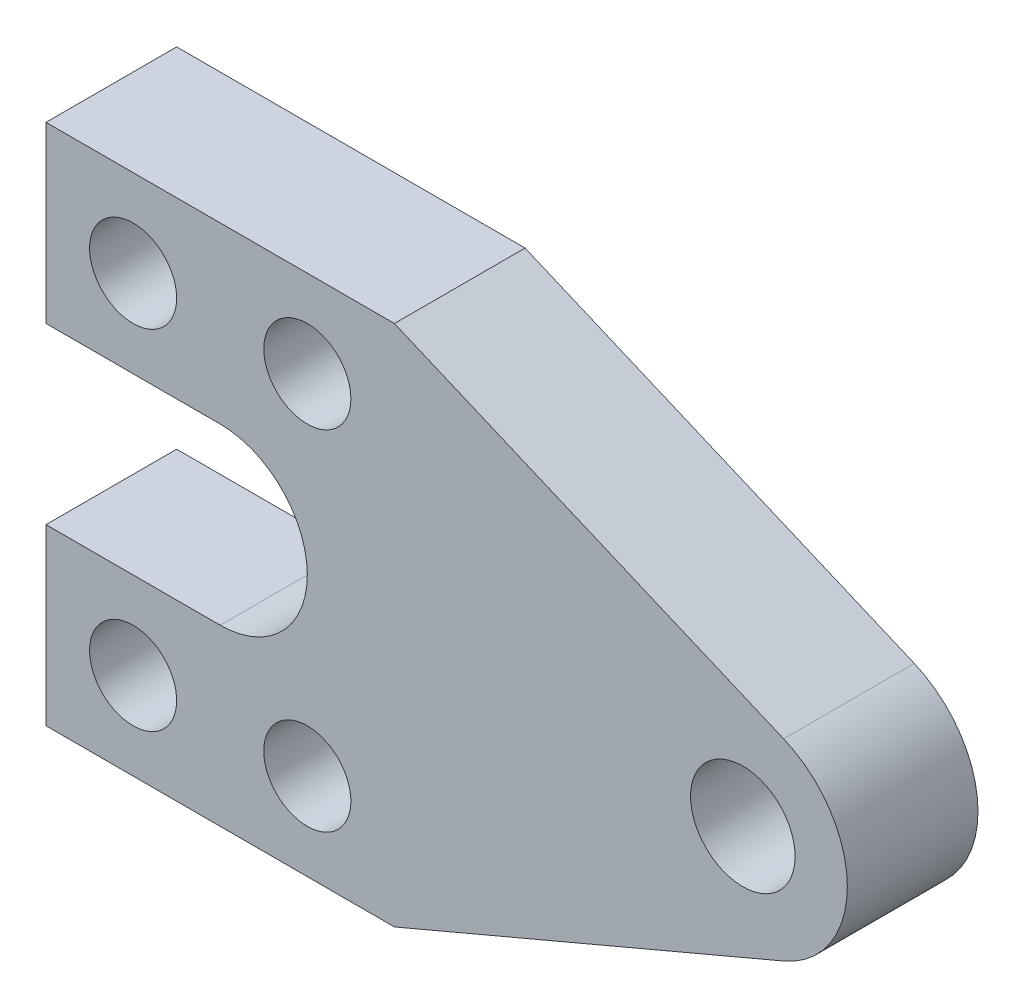
ISO-10303-21;
HEADER;
FILE_DESCRIPTION(('STEP AP214'),'2;1');
FILE_NAME('part.step','',(''),(''),'','','');
FILE_SCHEMA(('AUTOMOTIVE_DESIGN { 1 0 10303 214 1 1 1 1 }'));
ENDSEC;
DATA;
#1=APPLICATION_CONTEXT('core data for automotive mechanical design processes');
#2=APPLICATION_PROTOCOL_DEFINITION('international standard','automotive_design',2000,#1);
#3=PRODUCT_CONTEXT('',#1,'mechanical');
#4=PRODUCT('Part','Part','',(#3));
#5=PRODUCT_RELATED_PRODUCT_CATEGORY('part','',(#4));
#6=PRODUCT_DEFINITION_FORMATION('','',#4);
#7=PRODUCT_DEFINITION_CONTEXT('part definition',#1,'design');
#8=PRODUCT_DEFINITION('design','',#6,#7);
#9=PRODUCT_DEFINITION_SHAPE('','',#8);
#10=(LENGTH_UNIT() NAMED_UNIT(*) SI_UNIT(.MILLI.,.METRE.));
#11=(NAMED_UNIT(*) PLANE_ANGLE_UNIT() SI_UNIT($,.RADIAN.));
#12=(NAMED_UNIT(*) SI_UNIT($,.STERADIAN.) SOLID_ANGLE_UNIT());
#13=UNCERTAINTY_MEASURE_WITH_UNIT(LENGTH_MEASURE(1.E-05),#10,'distance_accuracy_value','');
#14=(GEOMETRIC_REPRESENTATION_CONTEXT(3) GLOBAL_UNCERTAINTY_ASSIGNED_CONTEXT((#13)) GLOBAL_UNIT_ASSIGNED_CONTEXT((#10,
#11,#12)) REPRESENTATION_CONTEXT('',''));
#15=CARTESIAN_POINT('',(0.,0.,0.));
#16=DIRECTION('',(0.,0.,1.));
#17=DIRECTION('',(1.,0.,0.));
#18=AXIS2_PLACEMENT_3D('',#15,#16,#17);
#19=CARTESIAN_POINT('',(-60.,0.,15.));
#20=DIRECTION('',(0.,0.,-1.));
#21=DIRECTION('',(-1.,0.,0.));
#22=AXIS2_PLACEMENT_3D('',#19,#20,#21);
#23=PLANE('',#22);
#24=DIRECTION('',(0.,-1.,0.));
#25=VECTOR('',#24,1.);
#26=CARTESIAN_POINT('',(-80.,30.,15.));
#27=LINE('',#26,#25);
#28=CARTESIAN_POINT('',(-80.,30.,15.));
#29=VERTEX_POINT('',#28);
#30=CARTESIAN_POINT('',(-80.,9.99999999999999,15.));
#31=VERTEX_POINT('',#30);
#32=EDGE_CURVE('E169',#29,#31,#27,.T.);
#33=ORIENTED_EDGE('',*,*,#32,.T.);
#34=DIRECTION('',(1.,0.,0.));
#35=VECTOR('',#34,1.);
#36=CARTESIAN_POINT('',(-80.,9.99999999999999,15.));
#37=LINE('',#36,#35);
#38=CARTESIAN_POINT('',(-60.,9.99999999999999,15.));
#39=VERTEX_POINT('',#38);
#40=EDGE_CURVE('E107',#31,#39,#37,.T.);
#41=ORIENTED_EDGE('',*,*,#40,.T.);
#42=CARTESIAN_POINT('',(-60.,0.,15.));
#43=DIRECTION('',(0.,0.,-1.));
#44=DIRECTION('',(-1.,0.,0.));
#45=AXIS2_PLACEMENT_3D('',#42,#43,#44);
#46=CIRCLE('',#45,10.);
#47=CARTESIAN_POINT('',(-60.,-10.,15.));
#48=VERTEX_POINT('',#47);
#49=EDGE_CURVE('E190',#39,#48,#46,.T.);
#50=ORIENTED_EDGE('',*,*,#49,.T.);
#51=DIRECTION('',(-1.,0.,0.));
#52=VECTOR('',#51,1.);
#53=CARTESIAN_POINT('',(-60.,-10.,15.));
#54=LINE('',#53,#52);
#55=CARTESIAN_POINT('',(-80.,-10.,15.));
#56=VERTEX_POINT('',#55);
#57=EDGE_CURVE('E209',#48,#56,#54,.T.);
#58=ORIENTED_EDGE('',*,*,#57,.T.);
#59=DIRECTION('',(0.,-1.,0.));
#60=VECTOR('',#59,1.);
#61=CARTESIAN_POINT('',(-80.,-10.,15.));
#62=LINE('',#61,#60);
#63=CARTESIAN_POINT('',(-80.,-30.,15.));
#64=VERTEX_POINT('',#63);
#65=EDGE_CURVE('E206',#56,#64,#62,.T.);
#66=ORIENTED_EDGE('',*,*,#65,.T.);
#67=DIRECTION('',(1.,0.,0.));
#68=VECTOR('',#67,1.);
#69=CARTESIAN_POINT('',(-80.,-30.,15.));
#70=LINE('',#69,#68);
#71=CARTESIAN_POINT('',(-40.,-30.,15.));
#72=VERTEX_POINT('',#71);
#73=EDGE_CURVE('E208',#64,#72,#70,.T.);
#74=ORIENTED_EDGE('',*,*,#73,.T.);
#75=DIRECTION('',(0.920618310368742,0.390463732776557,0.));
#76=VECTOR('',#75,1.);
#77=CARTESIAN_POINT('',(-40.,-30.,15.));
#78=LINE('',#77,#76);
#79=CARTESIAN_POINT('',(4.68556479331867,-11.0474197244249,15.));
#80=VERTEX_POINT('',#79);
#81=EDGE_CURVE('E132',#72,#80,#78,.T.);
#82=ORIENTED_EDGE('',*,*,#81,.T.);
#83=CARTESIAN_POINT('',(0.,0.,15.));
#84=DIRECTION('',(0.,0.,1.));
#85=DIRECTION('',(1.,0.,0.));
#86=AXIS2_PLACEMENT_3D('',#83,#84,#85);
#87=CIRCLE('',#86,12.);
#88=CARTESIAN_POINT('',(4.68556479331867,11.0474197244249,15.));
#89=VERTEX_POINT('',#88);
#90=EDGE_CURVE('E126',#80,#89,#87,.T.);
#91=ORIENTED_EDGE('',*,*,#90,.T.);
#92=DIRECTION('',(-0.920618310368742,0.390463732776557,0.));
#93=VECTOR('',#92,1.);
#94=CARTESIAN_POINT('',(-40.,30.,15.));
#95=LINE('',#94,#93);
#96=CARTESIAN_POINT('',(-40.,30.,15.));
#97=VERTEX_POINT('',#96);
#98=EDGE_CURVE('E130',#89,#97,#95,.T.);
#99=ORIENTED_EDGE('',*,*,#98,.T.);
#100=DIRECTION('',(-1.,0.,0.));
#101=VECTOR('',#100,1.);
#102=CARTESIAN_POINT('',(-80.,30.,15.));
#103=LINE('',#102,#101);
#104=EDGE_CURVE('E58',#97,#29,#103,.T.);
#105=ORIENTED_EDGE('',*,*,#104,.T.);
#106=EDGE_LOOP('',(#33,#41,#50,#58,#66,#74,#82,#91,#99,#105));
#107=FACE_BOUND('',#106,.T.);
#108=CARTESIAN_POINT('',(0.,0.,15.));
#109=DIRECTION('',(0.,0.,1.));
#110=DIRECTION('',(1.,0.,0.));
#111=AXIS2_PLACEMENT_3D('',#108,#109,#110);
#112=CIRCLE('',#111,6.);
#113=CARTESIAN_POINT('',(6.,0.,15.));
#114=VERTEX_POINT('',#113);
#115=EDGE_CURVE('E154',#114,#114,#112,.T.);
#116=ORIENTED_EDGE('',*,*,#115,.F.);
#117=EDGE_LOOP('',(#116));
#118=FACE_BOUND('',#117,.T.);
#119=CARTESIAN_POINT('',(-70.,20.,15.));
#120=DIRECTION('',(0.,0.,1.));
#121=DIRECTION('',(1.,0.,0.));
#122=AXIS2_PLACEMENT_3D('',#119,#120,#121);
#123=CIRCLE('',#122,5.);
#124=CARTESIAN_POINT('',(-65.,20.,15.));
#125=VERTEX_POINT('',#124);
#126=EDGE_CURVE('E220',#125,#125,#123,.T.);
#127=ORIENTED_EDGE('',*,*,#126,.F.);
#128=EDGE_LOOP('',(#127));
#129=FACE_BOUND('',#128,.T.);
#130=CARTESIAN_POINT('',(-50.,20.,15.));
#131=DIRECTION('',(0.,0.,1.));
#132=DIRECTION('',(1.,0.,0.));
#133=AXIS2_PLACEMENT_3D('',#130,#131,#132);
#134=CIRCLE('',#133,5.);
#135=CARTESIAN_POINT('',(-45.,20.,15.));
#136=VERTEX_POINT('',#135);
#137=EDGE_CURVE('E226',#136,#136,#134,.T.);
#138=ORIENTED_EDGE('',*,*,#137,.F.);
#139=EDGE_LOOP('',(#138));
#140=FACE_BOUND('',#139,.T.);
#141=CARTESIAN_POINT('',(-70.,-20.,15.));
#142=DIRECTION('',(0.,0.,1.));
#143=DIRECTION('',(-1.,0.,0.));
#144=AXIS2_PLACEMENT_3D('',#141,#142,#143);
#145=CIRCLE('',#144,5.);
#146=CARTESIAN_POINT('',(-75.,-20.,15.));
#147=VERTEX_POINT('',#146);
#148=EDGE_CURVE('E232',#147,#147,#145,.T.);
#149=ORIENTED_EDGE('',*,*,#148,.F.);
#150=EDGE_LOOP('',(#149));
#151=FACE_BOUND('',#150,.T.);
#152=CARTESIAN_POINT('',(-50.,-20.,15.));
#153=DIRECTION('',(0.,0.,1.));
#154=DIRECTION('',(-1.,0.,0.));
#155=AXIS2_PLACEMENT_3D('',#152,#153,#154);
#156=CIRCLE('',#155,5.);
#157=CARTESIAN_POINT('',(-55.,-20.,15.));
#158=VERTEX_POINT('',#157);
#159=EDGE_CURVE('E238',#158,#158,#156,.T.);
#160=ORIENTED_EDGE('',*,*,#159,.F.);
#161=EDGE_LOOP('',(#160));
#162=FACE_BOUND('',#161,.T.);
#163=ADVANCED_FACE('F41',(#107,#118,#129,#140,#151,#162),#23,.F.);
#164=CARTESIAN_POINT('',(-60.,0.,0.));
#165=DIRECTION('',(0.,0.,-1.));
#166=DIRECTION('',(-1.,0.,0.));
#167=AXIS2_PLACEMENT_3D('',#164,#165,#166);
#168=PLANE('',#167);
#169=CARTESIAN_POINT('',(-70.,-20.,0.));
#170=DIRECTION('',(0.,0.,1.));
#171=DIRECTION('',(-1.,0.,0.));
#172=AXIS2_PLACEMENT_3D('',#169,#170,#171);
#173=CIRCLE('',#172,5.);
#174=CARTESIAN_POINT('',(-75.,-20.,0.));
#175=VERTEX_POINT('',#174);
#176=EDGE_CURVE('E235',#175,#175,#173,.T.);
#177=ORIENTED_EDGE('',*,*,#176,.T.);
#178=EDGE_LOOP('',(#177));
#179=FACE_BOUND('',#178,.T.);
#180=CARTESIAN_POINT('',(-70.,20.,0.));
#181=DIRECTION('',(0.,0.,1.));
#182=DIRECTION('',(1.,0.,0.));
#183=AXIS2_PLACEMENT_3D('',#180,#181,#182);
#184=CIRCLE('',#183,5.);
#185=CARTESIAN_POINT('',(-65.,20.,0.));
#186=VERTEX_POINT('',#185);
#187=EDGE_CURVE('E223',#186,#186,#184,.T.);
#188=ORIENTED_EDGE('',*,*,#187,.T.);
#189=EDGE_LOOP('',(#188));
#190=FACE_BOUND('',#189,.T.);
#191=DIRECTION('',(0.,-1.,0.));
#192=VECTOR('',#191,1.);
#193=CARTESIAN_POINT('',(-80.,30.,0.));
#194=LINE('',#193,#192);
#195=CARTESIAN_POINT('',(-80.,30.,0.));
#196=VERTEX_POINT('',#195);
#197=CARTESIAN_POINT('',(-80.,9.99999999999999,0.));
#198=VERTEX_POINT('',#197);
#199=EDGE_CURVE('E150',#196,#198,#194,.T.);
#200=ORIENTED_EDGE('',*,*,#199,.F.);
#201=DIRECTION('',(-1.,0.,0.));
#202=VECTOR('',#201,1.);
#203=CARTESIAN_POINT('',(-80.,30.,0.));
#204=LINE('',#203,#202);
#205=CARTESIAN_POINT('',(-40.,30.,0.));
#206=VERTEX_POINT('',#205);
#207=EDGE_CURVE('E99',#206,#196,#204,.T.);
#208=ORIENTED_EDGE('',*,*,#207,.F.);
#209=DIRECTION('',(-0.920618310368742,0.390463732776557,0.));
#210=VECTOR('',#209,1.);
#211=CARTESIAN_POINT('',(-40.,30.,0.));
#212=LINE('',#211,#210);
#213=CARTESIAN_POINT('',(4.68556479331867,11.0474197244249,0.));
#214=VERTEX_POINT('',#213);
#215=EDGE_CURVE('E93',#214,#206,#212,.T.);
#216=ORIENTED_EDGE('',*,*,#215,.F.);
#217=CARTESIAN_POINT('',(0.,0.,0.));
#218=DIRECTION('',(0.,0.,1.));
#219=DIRECTION('',(1.,0.,0.));
#220=AXIS2_PLACEMENT_3D('',#217,#218,#219);
#221=CIRCLE('',#220,12.);
#222=CARTESIAN_POINT('',(4.68556479331867,-11.0474197244249,0.));
#223=VERTEX_POINT('',#222);
#224=EDGE_CURVE('E140',#223,#214,#221,.T.);
#225=ORIENTED_EDGE('',*,*,#224,.F.);
#226=DIRECTION('',(0.920618310368742,0.390463732776557,0.));
#227=VECTOR('',#226,1.);
#228=CARTESIAN_POINT('',(-40.,-30.,0.));
#229=LINE('',#228,#227);
#230=CARTESIAN_POINT('',(-40.,-30.,0.));
#231=VERTEX_POINT('',#230);
#232=EDGE_CURVE('E164',#231,#223,#229,.T.);
#233=ORIENTED_EDGE('',*,*,#232,.F.);
#234=DIRECTION('',(1.,0.,0.));
#235=VECTOR('',#234,1.);
#236=CARTESIAN_POINT('',(-80.,-30.,0.));
#237=LINE('',#236,#235);
#238=CARTESIAN_POINT('',(-80.,-30.,0.));
#239=VERTEX_POINT('',#238);
#240=EDGE_CURVE('E162',#239,#231,#237,.T.);
#241=ORIENTED_EDGE('',*,*,#240,.F.);
#242=DIRECTION('',(0.,-1.,0.));
#243=VECTOR('',#242,1.);
#244=CARTESIAN_POINT('',(-80.,-10.,0.));
#245=LINE('',#244,#243);
#246=CARTESIAN_POINT('',(-80.,-10.,0.));
#247=VERTEX_POINT('',#246);
#248=EDGE_CURVE('E160',#247,#239,#245,.T.);
#249=ORIENTED_EDGE('',*,*,#248,.F.);
#250=DIRECTION('',(-1.,0.,0.));
#251=VECTOR('',#250,1.);
#252=CARTESIAN_POINT('',(-60.,-10.,0.));
#253=LINE('',#252,#251);
#254=CARTESIAN_POINT('',(-60.,-10.,0.));
#255=VERTEX_POINT('',#254);
#256=EDGE_CURVE('E158',#255,#247,#253,.T.);
#257=ORIENTED_EDGE('',*,*,#256,.F.);
#258=CARTESIAN_POINT('',(-60.,0.,0.));
#259=DIRECTION('',(0.,0.,-1.));
#260=DIRECTION('',(-1.,0.,0.));
#261=AXIS2_PLACEMENT_3D('',#258,#259,#260);
#262=CIRCLE('',#261,10.);
#263=CARTESIAN_POINT('',(-60.,9.99999999999999,0.));
#264=VERTEX_POINT('',#263);
#265=EDGE_CURVE('E156',#264,#255,#262,.T.);
#266=ORIENTED_EDGE('',*,*,#265,.F.);
#267=DIRECTION('',(1.,0.,0.));
#268=VECTOR('',#267,1.);
#269=CARTESIAN_POINT('',(-80.,9.99999999999999,0.));
#270=LINE('',#269,#268);
#271=EDGE_CURVE('E153',#198,#264,#270,.T.);
#272=ORIENTED_EDGE('',*,*,#271,.F.);
#273=EDGE_LOOP('',(#200,#208,#216,#225,#233,#241,#249,#257,#266,#272));
#274=FACE_BOUND('',#273,.T.);
#275=CARTESIAN_POINT('',(0.,0.,0.));
#276=DIRECTION('',(0.,0.,1.));
#277=DIRECTION('',(1.,0.,0.));
#278=AXIS2_PLACEMENT_3D('',#275,#276,#277);
#279=CIRCLE('',#278,6.);
#280=CARTESIAN_POINT('',(6.,0.,0.));
#281=VERTEX_POINT('',#280);
#282=EDGE_CURVE('E217',#281,#281,#279,.T.);
#283=ORIENTED_EDGE('',*,*,#282,.T.);
#284=EDGE_LOOP('',(#283));
#285=FACE_BOUND('',#284,.T.);
#286=CARTESIAN_POINT('',(-50.,20.,0.));
#287=DIRECTION('',(0.,0.,1.));
#288=DIRECTION('',(1.,0.,0.));
#289=AXIS2_PLACEMENT_3D('',#286,#287,#288);
#290=CIRCLE('',#289,5.);
#291=CARTESIAN_POINT('',(-45.,20.,0.));
#292=VERTEX_POINT('',#291);
#293=EDGE_CURVE('E229',#292,#292,#290,.T.);
#294=ORIENTED_EDGE('',*,*,#293,.T.);
#295=EDGE_LOOP('',(#294));
#296=FACE_BOUND('',#295,.T.);
#297=CARTESIAN_POINT('',(-50.,-20.,0.));
#298=DIRECTION('',(0.,0.,1.));
#299=DIRECTION('',(-1.,0.,0.));
#300=AXIS2_PLACEMENT_3D('',#297,#298,#299);
#301=CIRCLE('',#300,5.);
#302=CARTESIAN_POINT('',(-55.,-20.,0.));
#303=VERTEX_POINT('',#302);
#304=EDGE_CURVE('E241',#303,#303,#301,.T.);
#305=ORIENTED_EDGE('',*,*,#304,.T.);
#306=EDGE_LOOP('',(#305));
#307=FACE_BOUND('',#306,.T.);
#308=ADVANCED_FACE('F194',(#179,#190,#274,#285,#296,#307),#168,.T.);
#309=CARTESIAN_POINT('',(-80.,30.,15.));
#310=DIRECTION('',(1.,0.,0.));
#311=DIRECTION('',(0.,0.,-1.));
#312=AXIS2_PLACEMENT_3D('',#309,#310,#311);
#313=PLANE('',#312);
#314=ORIENTED_EDGE('',*,*,#199,.T.);
#315=DIRECTION('',(0.,0.,-1.));
#316=VECTOR('',#315,1.);
#317=CARTESIAN_POINT('',(-80.,9.99999999999999,15.));
#318=LINE('',#317,#316);
#319=EDGE_CURVE('E11',#31,#198,#318,.T.);
#320=ORIENTED_EDGE('',*,*,#319,.F.);
#321=ORIENTED_EDGE('',*,*,#32,.F.);
#322=DIRECTION('',(0.,0.,-1.));
#323=VECTOR('',#322,1.);
#324=CARTESIAN_POINT('',(-80.,30.,15.));
#325=LINE('',#324,#323);
#326=EDGE_CURVE('E146',#29,#196,#325,.T.);
#327=ORIENTED_EDGE('',*,*,#326,.T.);
#328=EDGE_LOOP('',(#314,#320,#321,#327));
#329=FACE_BOUND('',#328,.T.);
#330=ADVANCED_FACE('F43',(#329),#313,.F.);
#331=CARTESIAN_POINT('',(-80.,9.99999999999999,15.));
#332=DIRECTION('',(0.,1.,0.));
#333=DIRECTION('',(-1.,0.,0.));
#334=AXIS2_PLACEMENT_3D('',#331,#332,#333);
#335=PLANE('',#334);
#336=ORIENTED_EDGE('',*,*,#271,.T.);
#337=DIRECTION('',(0.,0.,-1.));
#338=VECTOR('',#337,1.);
#339=CARTESIAN_POINT('',(-60.,9.99999999999999,15.));
#340=LINE('',#339,#338);
#341=EDGE_CURVE('E50',#39,#264,#340,.T.);
#342=ORIENTED_EDGE('',*,*,#341,.F.);
#343=ORIENTED_EDGE('',*,*,#40,.F.);
#344=ORIENTED_EDGE('',*,*,#319,.T.);
#345=EDGE_LOOP('',(#336,#342,#343,#344));
#346=FACE_BOUND('',#345,.T.);
#347=ADVANCED_FACE('F281',(#346),#335,.F.);
#348=CARTESIAN_POINT('',(-60.,0.,15.));
#349=DIRECTION('',(0.,0.,-1.));
#350=DIRECTION('',(-1.,0.,0.));
#351=AXIS2_PLACEMENT_3D('',#348,#349,#350);
#352=CYLINDRICAL_SURFACE('',#351,10.);
#353=ORIENTED_EDGE('',*,*,#265,.T.);
#354=DIRECTION('',(0.,0.,-1.));
#355=VECTOR('',#354,1.);
#356=CARTESIAN_POINT('',(-60.,-10.,15.));
#357=LINE('',#356,#355);
#358=EDGE_CURVE('E182',#48,#255,#357,.T.);
#359=ORIENTED_EDGE('',*,*,#358,.F.);
#360=ORIENTED_EDGE('',*,*,#49,.F.);
#361=ORIENTED_EDGE('',*,*,#341,.T.);
#362=EDGE_LOOP('',(#353,#359,#360,#361));
#363=FACE_BOUND('',#362,.T.);
#364=ADVANCED_FACE('F188',(#363),#352,.F.);
#365=CARTESIAN_POINT('',(-60.,-10.,15.));
#366=DIRECTION('',(0.,-1.,0.));
#367=DIRECTION('',(1.,0.,0.));
#368=AXIS2_PLACEMENT_3D('',#365,#366,#367);
#369=PLANE('',#368);
#370=ORIENTED_EDGE('',*,*,#256,.T.);
#371=DIRECTION('',(0.,0.,-1.));
#372=VECTOR('',#371,1.);
#373=CARTESIAN_POINT('',(-80.,-10.,15.));
#374=LINE('',#373,#372);
#375=EDGE_CURVE('E179',#56,#247,#374,.T.);
#376=ORIENTED_EDGE('',*,*,#375,.F.);
#377=ORIENTED_EDGE('',*,*,#57,.F.);
#378=ORIENTED_EDGE('',*,*,#358,.T.);
#379=EDGE_LOOP('',(#370,#376,#377,#378));
#380=FACE_BOUND('',#379,.T.);
#381=ADVANCED_FACE('F200',(#380),#369,.F.);
#382=CARTESIAN_POINT('',(-80.,-10.,15.));
#383=DIRECTION('',(1.,0.,0.));
#384=DIRECTION('',(0.,1.,0.));
#385=AXIS2_PLACEMENT_3D('',#382,#383,#384);
#386=PLANE('',#385);
#387=ORIENTED_EDGE('',*,*,#248,.T.);
#388=DIRECTION('',(0.,0.,-1.));
#389=VECTOR('',#388,1.);
#390=CARTESIAN_POINT('',(-80.,-30.,15.));
#391=LINE('',#390,#389);
#392=EDGE_CURVE('E176',#64,#239,#391,.T.);
#393=ORIENTED_EDGE('',*,*,#392,.F.);
#394=ORIENTED_EDGE('',*,*,#65,.F.);
#395=ORIENTED_EDGE('',*,*,#375,.T.);
#396=EDGE_LOOP('',(#387,#393,#394,#395));
#397=FACE_BOUND('',#396,.T.);
#398=ADVANCED_FACE('F204',(#397),#386,.F.);
#399=CARTESIAN_POINT('',(-80.,-30.,15.));
#400=DIRECTION('',(0.,1.,0.));
#401=DIRECTION('',(-1.,0.,0.));
#402=AXIS2_PLACEMENT_3D('',#399,#400,#401);
#403=PLANE('',#402);
#404=ORIENTED_EDGE('',*,*,#240,.T.);
#405=DIRECTION('',(0.,0.,-1.));
#406=VECTOR('',#405,1.);
#407=CARTESIAN_POINT('',(-40.,-30.,15.));
#408=LINE('',#407,#406);
#409=EDGE_CURVE('E173',#72,#231,#408,.T.);
#410=ORIENTED_EDGE('',*,*,#409,.F.);
#411=ORIENTED_EDGE('',*,*,#73,.F.);
#412=ORIENTED_EDGE('',*,*,#392,.T.);
#413=EDGE_LOOP('',(#404,#410,#411,#412));
#414=FACE_BOUND('',#413,.T.);
#415=ADVANCED_FACE('F271',(#414),#403,.F.);
#416=CARTESIAN_POINT('',(-40.,-30.,15.));
#417=DIRECTION('',(-0.390463732776557,0.920618310368742,0.));
#418=DIRECTION('',(-0.920618310368742,-0.390463732776557,0.));
#419=AXIS2_PLACEMENT_3D('',#416,#417,#418);
#420=PLANE('',#419);
#421=ORIENTED_EDGE('',*,*,#232,.T.);
#422=DIRECTION('',(0.,0.,-1.));
#423=VECTOR('',#422,1.);
#424=CARTESIAN_POINT('',(4.68556479331867,-11.0474197244249,15.));
#425=LINE('',#424,#423);
#426=EDGE_CURVE('E141',#80,#223,#425,.T.);
#427=ORIENTED_EDGE('',*,*,#426,.F.);
#428=ORIENTED_EDGE('',*,*,#81,.F.);
#429=ORIENTED_EDGE('',*,*,#409,.T.);
#430=EDGE_LOOP('',(#421,#427,#428,#429));
#431=FACE_BOUND('',#430,.T.);
#432=ADVANCED_FACE('F268',(#431),#420,.F.);
#433=CARTESIAN_POINT('',(0.,0.,15.));
#434=DIRECTION('',(0.,0.,-1.));
#435=DIRECTION('',(-1.,0.,0.));
#436=AXIS2_PLACEMENT_3D('',#433,#434,#435);
#437=CYLINDRICAL_SURFACE('',#436,12.);
#438=ORIENTED_EDGE('',*,*,#224,.T.);
#439=DIRECTION('',(0.,0.,-1.));
#440=VECTOR('',#439,1.);
#441=CARTESIAN_POINT('',(4.68556479331867,11.0474197244249,15.));
#442=LINE('',#441,#440);
#443=EDGE_CURVE('E137',#89,#214,#442,.T.);
#444=ORIENTED_EDGE('',*,*,#443,.F.);
#445=ORIENTED_EDGE('',*,*,#90,.F.);
#446=ORIENTED_EDGE('',*,*,#426,.T.);
#447=EDGE_LOOP('',(#438,#444,#445,#446));
#448=FACE_BOUND('',#447,.T.);
#449=ADVANCED_FACE('F138',(#448),#437,.T.);
#450=CARTESIAN_POINT('',(-40.,30.,15.));
#451=DIRECTION('',(-0.390463732776556,-0.920618310368742,0.));
#452=DIRECTION('',(0.920618310368742,-0.390463732776556,0.));
#453=AXIS2_PLACEMENT_3D('',#450,#451,#452);
#454=PLANE('',#453);
#455=ORIENTED_EDGE('',*,*,#215,.T.);
#456=DIRECTION('',(0.,0.,-1.));
#457=VECTOR('',#456,1.);
#458=CARTESIAN_POINT('',(-40.,30.,15.));
#459=LINE('',#458,#457);
#460=EDGE_CURVE('E142',#97,#206,#459,.T.);
#461=ORIENTED_EDGE('',*,*,#460,.F.);
#462=ORIENTED_EDGE('',*,*,#98,.F.);
#463=ORIENTED_EDGE('',*,*,#443,.T.);
#464=EDGE_LOOP('',(#455,#461,#462,#463));
#465=FACE_BOUND('',#464,.T.);
#466=ADVANCED_FACE('F144',(#465),#454,.F.);
#467=CARTESIAN_POINT('',(-80.,30.,15.));
#468=DIRECTION('',(0.,-1.,0.));
#469=DIRECTION('',(0.,0.,-1.));
#470=AXIS2_PLACEMENT_3D('',#467,#468,#469);
#471=PLANE('',#470);
#472=ORIENTED_EDGE('',*,*,#207,.T.);
#473=ORIENTED_EDGE('',*,*,#326,.F.);
#474=ORIENTED_EDGE('',*,*,#104,.F.);
#475=ORIENTED_EDGE('',*,*,#460,.T.);
#476=EDGE_LOOP('',(#472,#473,#474,#475));
#477=FACE_BOUND('',#476,.T.);
#478=ADVANCED_FACE('F261',(#477),#471,.F.);
#479=CARTESIAN_POINT('',(0.,0.,15.));
#480=DIRECTION('',(0.,0.,-1.));
#481=DIRECTION('',(-1.,0.,0.));
#482=AXIS2_PLACEMENT_3D('',#479,#480,#481);
#483=CYLINDRICAL_SURFACE('',#482,6.);
#484=ORIENTED_EDGE('',*,*,#115,.T.);
#485=EDGE_LOOP('',(#484));
#486=FACE_BOUND('',#485,.T.);
#487=ORIENTED_EDGE('',*,*,#282,.F.);
#488=EDGE_LOOP('',(#487));
#489=FACE_BOUND('',#488,.T.);
#490=ADVANCED_FACE('F258',(#486,#489),#483,.F.);
#491=CARTESIAN_POINT('',(-70.,20.,15.));
#492=DIRECTION('',(0.,0.,-1.));
#493=DIRECTION('',(-1.,0.,0.));
#494=AXIS2_PLACEMENT_3D('',#491,#492,#493);
#495=CYLINDRICAL_SURFACE('',#494,5.);
#496=ORIENTED_EDGE('',*,*,#126,.T.);
#497=EDGE_LOOP('',(#496));
#498=FACE_BOUND('',#497,.T.);
#499=ORIENTED_EDGE('',*,*,#187,.F.);
#500=EDGE_LOOP('',(#499));
#501=FACE_BOUND('',#500,.T.);
#502=ADVANCED_FACE('F371',(#498,#501),#495,.F.);
#503=CARTESIAN_POINT('',(-50.,20.,15.));
#504=DIRECTION('',(0.,0.,-1.));
#505=DIRECTION('',(-1.,0.,0.));
#506=AXIS2_PLACEMENT_3D('',#503,#504,#505);
#507=CYLINDRICAL_SURFACE('',#506,5.);
#508=ORIENTED_EDGE('',*,*,#137,.T.);
#509=EDGE_LOOP('',(#508));
#510=FACE_BOUND('',#509,.T.);
#511=ORIENTED_EDGE('',*,*,#293,.F.);
#512=EDGE_LOOP('',(#511));
#513=FACE_BOUND('',#512,.T.);
#514=ADVANCED_FACE('F380',(#510,#513),#507,.F.);
#515=CARTESIAN_POINT('',(-70.,-20.,15.));
#516=DIRECTION('',(0.,0.,-1.));
#517=DIRECTION('',(-1.,0.,0.));
#518=AXIS2_PLACEMENT_3D('',#515,#516,#517);
#519=CYLINDRICAL_SURFACE('',#518,5.);
#520=ORIENTED_EDGE('',*,*,#148,.T.);
#521=EDGE_LOOP('',(#520));
#522=FACE_BOUND('',#521,.T.);
#523=ORIENTED_EDGE('',*,*,#176,.F.);
#524=EDGE_LOOP('',(#523));
#525=FACE_BOUND('',#524,.T.);
#526=ADVANCED_FACE('F389',(#522,#525),#519,.F.);
#527=CARTESIAN_POINT('',(-50.,-20.,15.));
#528=DIRECTION('',(0.,0.,-1.));
#529=DIRECTION('',(-1.,0.,0.));
#530=AXIS2_PLACEMENT_3D('',#527,#528,#529);
#531=CYLINDRICAL_SURFACE('',#530,5.);
#532=ORIENTED_EDGE('',*,*,#159,.T.);
#533=EDGE_LOOP('',(#532));
#534=FACE_BOUND('',#533,.T.);
#535=ORIENTED_EDGE('',*,*,#304,.F.);
#536=EDGE_LOOP('',(#535));
#537=FACE_BOUND('',#536,.T.);
#538=ADVANCED_FACE('F247',(#534,#537),#531,.F.);
#539=CLOSED_SHELL('',(#163,#308,#330,#347,#364,#381,#398,#415,#432,#449,#466,#478,#490,#502,
#514,#526,#538));
#540=MANIFOLD_SOLID_BREP('B2',#539);
#541=ADVANCED_BREP_SHAPE_REPRESENTATION('',(#18,#540),#14);
#542=SHAPE_DEFINITION_REPRESENTATION(#9,#541);
ENDSEC;
END-ISO-10303-21;
